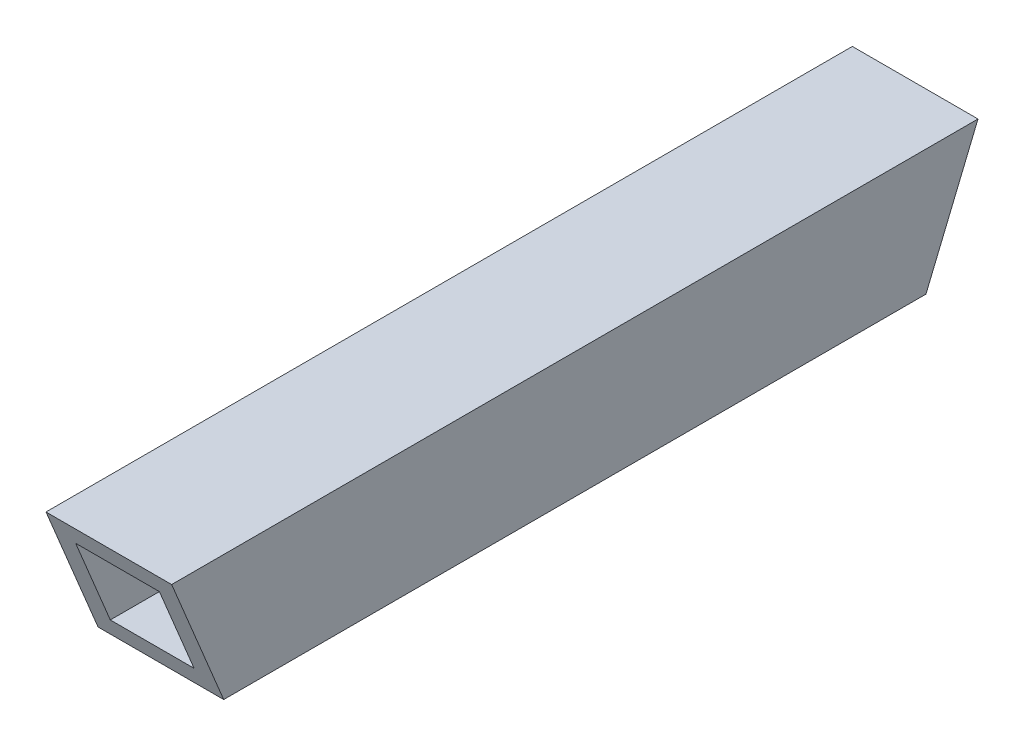
ISO-10303-21;
HEADER;
FILE_DESCRIPTION(('STEP AP214'),'2;1');
FILE_NAME('part.step','',(''),(''),'','','');
FILE_SCHEMA(('AUTOMOTIVE_DESIGN { 1 0 10303 214 1 1 1 1 }'));
ENDSEC;
DATA;
#1=APPLICATION_CONTEXT('core data for automotive mechanical design processes');
#2=APPLICATION_PROTOCOL_DEFINITION('international standard','automotive_design',2000,#1);
#3=PRODUCT_CONTEXT('',#1,'mechanical');
#4=PRODUCT('Part','Part','',(#3));
#5=PRODUCT_RELATED_PRODUCT_CATEGORY('part','',(#4));
#6=PRODUCT_DEFINITION_FORMATION('','',#4);
#7=PRODUCT_DEFINITION_CONTEXT('part definition',#1,'design');
#8=PRODUCT_DEFINITION('design','',#6,#7);
#9=PRODUCT_DEFINITION_SHAPE('','',#8);
#10=(LENGTH_UNIT() NAMED_UNIT(*) SI_UNIT(.MILLI.,.METRE.));
#11=(NAMED_UNIT(*) PLANE_ANGLE_UNIT() SI_UNIT($,.RADIAN.));
#12=(NAMED_UNIT(*) SI_UNIT($,.STERADIAN.) SOLID_ANGLE_UNIT());
#13=UNCERTAINTY_MEASURE_WITH_UNIT(LENGTH_MEASURE(1.E-05),#10,'distance_accuracy_value','');
#14=(GEOMETRIC_REPRESENTATION_CONTEXT(3) GLOBAL_UNCERTAINTY_ASSIGNED_CONTEXT((#13)) GLOBAL_UNIT_ASSIGNED_CONTEXT((#10,
#11,#12)) REPRESENTATION_CONTEXT('',''));
#15=CARTESIAN_POINT('',(0.,0.,0.));
#16=DIRECTION('',(0.,0.,1.));
#17=DIRECTION('',(1.,0.,0.));
#18=AXIS2_PLACEMENT_3D('',#15,#16,#17);
#19=CARTESIAN_POINT('',(9.525,-9.525,61.11875));
#20=DIRECTION('',(-1.,0.,0.));
#21=DIRECTION('',(0.,0.,1.));
#22=AXIS2_PLACEMENT_3D('',#19,#20,#21);
#23=PLANE('',#22);
#24=DIRECTION('',(0.,0.,-1.));
#25=VECTOR('',#24,1.);
#26=CARTESIAN_POINT('',(9.525,-9.525,61.11875));
#27=LINE('',#26,#25);
#28=CARTESIAN_POINT('',(9.525,-9.525,53.2279816367927));
#29=VERTEX_POINT('',#28);
#30=CARTESIAN_POINT('',(9.525,-9.525,-53.2279816367927));
#31=VERTEX_POINT('',#30);
#32=EDGE_CURVE('E125',#29,#31,#27,.T.);
#33=ORIENTED_EDGE('',*,*,#32,.T.);
#34=DIRECTION('',(0.,-0.923879532511289,0.382683432365084));
#35=VECTOR('',#34,1.);
#36=CARTESIAN_POINT('',(9.525,9.525,-61.11875));
#37=LINE('',#36,#35);
#38=CARTESIAN_POINT('',(9.525,9.525,-61.11875));
#39=VERTEX_POINT('',#38);
#40=EDGE_CURVE('E51',#39,#31,#37,.T.);
#41=ORIENTED_EDGE('',*,*,#40,.F.);
#42=DIRECTION('',(0.,0.,-1.));
#43=VECTOR('',#42,1.);
#44=CARTESIAN_POINT('',(9.525,9.525,61.11875));
#45=LINE('',#44,#43);
#46=CARTESIAN_POINT('',(9.525,9.525,61.11875));
#47=VERTEX_POINT('',#46);
#48=EDGE_CURVE('E115',#47,#39,#45,.T.);
#49=ORIENTED_EDGE('',*,*,#48,.F.);
#50=DIRECTION('',(0.,0.923879532511289,0.382683432365084));
#51=VECTOR('',#50,1.);
#52=CARTESIAN_POINT('',(9.525,9.525,61.11875));
#53=LINE('',#52,#51);
#54=EDGE_CURVE('E164',#29,#47,#53,.T.);
#55=ORIENTED_EDGE('',*,*,#54,.F.);
#56=EDGE_LOOP('',(#33,#41,#49,#55));
#57=FACE_BOUND('',#56,.T.);
#58=ADVANCED_FACE('F37',(#57),#23,.F.);
#59=CARTESIAN_POINT('',(-9.525,9.525,61.11875));
#60=DIRECTION('',(0.,-1.,0.));
#61=DIRECTION('',(0.,0.,-1.));
#62=AXIS2_PLACEMENT_3D('',#59,#60,#61);
#63=PLANE('',#62);
#64=DIRECTION('',(-1.,0.,0.));
#65=VECTOR('',#64,1.);
#66=CARTESIAN_POINT('',(-9.525,9.525,-61.11875));
#67=LINE('',#66,#65);
#68=CARTESIAN_POINT('',(-9.52500000000001,9.525,-61.11875));
#69=VERTEX_POINT('',#68);
#70=EDGE_CURVE('E101',#39,#69,#67,.T.);
#71=ORIENTED_EDGE('',*,*,#70,.T.);
#72=DIRECTION('',(0.,0.,-1.));
#73=VECTOR('',#72,1.);
#74=CARTESIAN_POINT('',(-9.525,9.525,61.11875));
#75=LINE('',#74,#73);
#76=CARTESIAN_POINT('',(-9.52500000000001,9.525,61.11875));
#77=VERTEX_POINT('',#76);
#78=EDGE_CURVE('E113',#77,#69,#75,.T.);
#79=ORIENTED_EDGE('',*,*,#78,.F.);
#80=DIRECTION('',(-1.,0.,0.));
#81=VECTOR('',#80,1.);
#82=CARTESIAN_POINT('',(-9.525,9.525,61.11875));
#83=LINE('',#82,#81);
#84=EDGE_CURVE('E116',#47,#77,#83,.T.);
#85=ORIENTED_EDGE('',*,*,#84,.F.);
#86=ORIENTED_EDGE('',*,*,#48,.T.);
#87=EDGE_LOOP('',(#71,#79,#85,#86));
#88=FACE_BOUND('',#87,.T.);
#89=ADVANCED_FACE('F111',(#88),#63,.F.);
#90=CARTESIAN_POINT('',(-9.525,-9.525,61.11875));
#91=DIRECTION('',(1.,0.,0.));
#92=DIRECTION('',(0.,1.,0.));
#93=AXIS2_PLACEMENT_3D('',#90,#91,#92);
#94=PLANE('',#93);
#95=ORIENTED_EDGE('',*,*,#78,.T.);
#96=DIRECTION('',(0.,-0.923879532511289,0.382683432365084));
#97=VECTOR('',#96,1.);
#98=CARTESIAN_POINT('',(-9.52500000000001,9.525,-61.11875));
#99=LINE('',#98,#97);
#100=CARTESIAN_POINT('',(-9.52500000000001,-9.525,-53.2279816367927));
#101=VERTEX_POINT('',#100);
#102=EDGE_CURVE('E98',#69,#101,#99,.T.);
#103=ORIENTED_EDGE('',*,*,#102,.T.);
#104=DIRECTION('',(0.,0.,-1.));
#105=VECTOR('',#104,1.);
#106=CARTESIAN_POINT('',(-9.525,-9.525,61.11875));
#107=LINE('',#106,#105);
#108=CARTESIAN_POINT('',(-9.525,-9.525,53.2279816367927));
#109=VERTEX_POINT('',#108);
#110=EDGE_CURVE('E122',#109,#101,#107,.T.);
#111=ORIENTED_EDGE('',*,*,#110,.F.);
#112=DIRECTION('',(0.,0.923879532511289,0.382683432365084));
#113=VECTOR('',#112,1.);
#114=CARTESIAN_POINT('',(-9.52500000000001,9.525,61.11875));
#115=LINE('',#114,#113);
#116=EDGE_CURVE('E121',#109,#77,#115,.T.);
#117=ORIENTED_EDGE('',*,*,#116,.T.);
#118=EDGE_LOOP('',(#95,#103,#111,#117));
#119=FACE_BOUND('',#118,.T.);
#120=ADVANCED_FACE('F120',(#119),#94,.F.);
#121=CARTESIAN_POINT('',(-9.525,-9.525,61.11875));
#122=DIRECTION('',(0.,1.,0.));
#123=DIRECTION('',(0.,0.,1.));
#124=AXIS2_PLACEMENT_3D('',#121,#122,#123);
#125=PLANE('',#124);
#126=ORIENTED_EDGE('',*,*,#110,.T.);
#127=DIRECTION('',(1.,0.,0.));
#128=VECTOR('',#127,1.);
#129=CARTESIAN_POINT('',(-9.52500000000001,-9.525,-53.2279816367927));
#130=LINE('',#129,#128);
#131=EDGE_CURVE('E102',#101,#31,#130,.T.);
#132=ORIENTED_EDGE('',*,*,#131,.T.);
#133=ORIENTED_EDGE('',*,*,#32,.F.);
#134=DIRECTION('',(1.,0.,0.));
#135=VECTOR('',#134,1.);
#136=CARTESIAN_POINT('',(-9.52500000000001,-9.525,53.2279816367927));
#137=LINE('',#136,#135);
#138=EDGE_CURVE('E149',#109,#29,#137,.T.);
#139=ORIENTED_EDGE('',*,*,#138,.F.);
#140=EDGE_LOOP('',(#126,#132,#133,#139));
#141=FACE_BOUND('',#140,.T.);
#142=ADVANCED_FACE('F167',(#141),#125,.F.);
#143=CARTESIAN_POINT('',(6.34999999999999,-6.34999999999999,61.11875));
#144=DIRECTION('',(-1.,0.,0.));
#145=DIRECTION('',(0.,0.,1.));
#146=AXIS2_PLACEMENT_3D('',#143,#144,#145);
#147=PLANE('',#146);
#148=DIRECTION('',(0.,0.923879532511289,-0.382683432365084));
#149=VECTOR('',#148,1.);
#150=CARTESIAN_POINT('',(6.34999999999999,-47.242642658313,-37.6048225069777));
#151=LINE('',#150,#149);
#152=CARTESIAN_POINT('',(6.34999999999999,-6.34999999999999,-54.5431096973272));
#153=VERTEX_POINT('',#152);
#154=CARTESIAN_POINT('',(6.34999999999999,6.35,-59.8036219394654));
#155=VERTEX_POINT('',#154);
#156=EDGE_CURVE('E174',#153,#155,#151,.T.);
#157=ORIENTED_EDGE('',*,*,#156,.F.);
#158=DIRECTION('',(0.,0.,-1.));
#159=VECTOR('',#158,1.);
#160=CARTESIAN_POINT('',(6.34999999999999,-6.34999999999999,61.11875));
#161=LINE('',#160,#159);
#162=CARTESIAN_POINT('',(6.34999999999999,-6.34999999999999,54.5431096973272));
#163=VERTEX_POINT('',#162);
#164=EDGE_CURVE('E152',#163,#153,#161,.T.);
#165=ORIENTED_EDGE('',*,*,#164,.F.);
#166=DIRECTION('',(0.,-0.923879532511289,-0.382683432365084));
#167=VECTOR('',#166,1.);
#168=CARTESIAN_POINT('',(6.34999999999999,-4.02516007566829,55.5060899243319));
#169=LINE('',#168,#167);
#170=CARTESIAN_POINT('',(6.34999999999999,6.35,59.8036219394654));
#171=VERTEX_POINT('',#170);
#172=EDGE_CURVE('E136',#171,#163,#169,.T.);
#173=ORIENTED_EDGE('',*,*,#172,.F.);
#174=DIRECTION('',(0.,0.,-1.));
#175=VECTOR('',#174,1.);
#176=CARTESIAN_POINT('',(6.34999999999999,6.35,61.11875));
#177=LINE('',#176,#175);
#178=EDGE_CURVE('E117',#171,#155,#177,.T.);
#179=ORIENTED_EDGE('',*,*,#178,.T.);
#180=EDGE_LOOP('',(#157,#165,#173,#179));
#181=FACE_BOUND('',#180,.T.);
#182=ADVANCED_FACE('F183',(#181),#147,.T.);
#183=CARTESIAN_POINT('',(-6.35,6.35,61.11875));
#184=DIRECTION('',(0.,-1.,0.));
#185=DIRECTION('',(0.,0.,-1.));
#186=AXIS2_PLACEMENT_3D('',#183,#184,#185);
#187=PLANE('',#186);
#188=DIRECTION('',(-1.,0.,0.));
#189=VECTOR('',#188,1.);
#190=CARTESIAN_POINT('',(-6.35,6.35,-59.8036219394654));
#191=LINE('',#190,#189);
#192=CARTESIAN_POINT('',(-6.35,6.35,-59.8036219394655));
#193=VERTEX_POINT('',#192);
#194=EDGE_CURVE('E169',#155,#193,#191,.T.);
#195=ORIENTED_EDGE('',*,*,#194,.F.);
#196=ORIENTED_EDGE('',*,*,#178,.F.);
#197=DIRECTION('',(1.,0.,0.));
#198=VECTOR('',#197,1.);
#199=CARTESIAN_POINT('',(-6.35,6.35,59.8036219394654));
#200=LINE('',#199,#198);
#201=CARTESIAN_POINT('',(-6.35,6.35,59.8036219394655));
#202=VERTEX_POINT('',#201);
#203=EDGE_CURVE('E148',#202,#171,#200,.T.);
#204=ORIENTED_EDGE('',*,*,#203,.F.);
#205=DIRECTION('',(0.,0.,-1.));
#206=VECTOR('',#205,1.);
#207=CARTESIAN_POINT('',(-6.35,6.35,61.11875));
#208=LINE('',#207,#206);
#209=EDGE_CURVE('E147',#202,#193,#208,.T.);
#210=ORIENTED_EDGE('',*,*,#209,.T.);
#211=EDGE_LOOP('',(#195,#196,#204,#210));
#212=FACE_BOUND('',#211,.T.);
#213=ADVANCED_FACE('F185',(#212),#187,.T.);
#214=CARTESIAN_POINT('',(-6.35,-6.34999999999999,61.11875));
#215=DIRECTION('',(1.,0.,0.));
#216=DIRECTION('',(0.,0.,-1.));
#217=AXIS2_PLACEMENT_3D('',#214,#215,#216);
#218=PLANE('',#217);
#219=DIRECTION('',(0.,-0.923879532511289,0.382683432365084));
#220=VECTOR('',#219,1.);
#221=CARTESIAN_POINT('',(-6.35,-47.242642658313,-37.6048225069777));
#222=LINE('',#221,#220);
#223=CARTESIAN_POINT('',(-6.35,-6.34999999999999,-54.5431096973272));
#224=VERTEX_POINT('',#223);
#225=EDGE_CURVE('E58',#193,#224,#222,.T.);
#226=ORIENTED_EDGE('',*,*,#225,.F.);
#227=ORIENTED_EDGE('',*,*,#209,.F.);
#228=DIRECTION('',(0.,0.923879532511289,0.382683432365084));
#229=VECTOR('',#228,1.);
#230=CARTESIAN_POINT('',(-6.35,-4.02516007566829,55.5060899243319));
#231=LINE('',#230,#229);
#232=CARTESIAN_POINT('',(-6.35,-6.34999999999999,54.5431096973272));
#233=VERTEX_POINT('',#232);
#234=EDGE_CURVE('E133',#233,#202,#231,.T.);
#235=ORIENTED_EDGE('',*,*,#234,.F.);
#236=DIRECTION('',(0.,0.,-1.));
#237=VECTOR('',#236,1.);
#238=CARTESIAN_POINT('',(-6.35,-6.34999999999999,61.11875));
#239=LINE('',#238,#237);
#240=EDGE_CURVE('E145',#233,#224,#239,.T.);
#241=ORIENTED_EDGE('',*,*,#240,.T.);
#242=EDGE_LOOP('',(#226,#227,#235,#241));
#243=FACE_BOUND('',#242,.T.);
#244=ADVANCED_FACE('F144',(#243),#218,.T.);
#245=CARTESIAN_POINT('',(-6.35,-6.34999999999999,61.11875));
#246=DIRECTION('',(0.,1.,0.));
#247=DIRECTION('',(0.,0.,1.));
#248=AXIS2_PLACEMENT_3D('',#245,#246,#247);
#249=PLANE('',#248);
#250=DIRECTION('',(1.,0.,0.));
#251=VECTOR('',#250,1.);
#252=CARTESIAN_POINT('',(-6.35,-6.34999999999999,-54.5431096973272));
#253=LINE('',#252,#251);
#254=EDGE_CURVE('E11',#224,#153,#253,.T.);
#255=ORIENTED_EDGE('',*,*,#254,.F.);
#256=ORIENTED_EDGE('',*,*,#240,.F.);
#257=DIRECTION('',(-1.,0.,0.));
#258=VECTOR('',#257,1.);
#259=CARTESIAN_POINT('',(-6.35,-6.34999999999999,54.5431096973272));
#260=LINE('',#259,#258);
#261=EDGE_CURVE('E44',#163,#233,#260,.T.);
#262=ORIENTED_EDGE('',*,*,#261,.F.);
#263=ORIENTED_EDGE('',*,*,#164,.T.);
#264=EDGE_LOOP('',(#255,#256,#262,#263));
#265=FACE_BOUND('',#264,.T.);
#266=ADVANCED_FACE('F151',(#265),#249,.T.);
#267=CARTESIAN_POINT('',(-9.52500000000001,9.525,61.11875));
#268=DIRECTION('',(0.,0.382683432365084,-0.923879532511289));
#269=DIRECTION('',(0.,0.923879532511289,0.382683432365084));
#270=AXIS2_PLACEMENT_3D('',#267,#268,#269);
#271=PLANE('',#270);
#272=ORIENTED_EDGE('',*,*,#172,.T.);
#273=ORIENTED_EDGE('',*,*,#261,.T.);
#274=ORIENTED_EDGE('',*,*,#234,.T.);
#275=ORIENTED_EDGE('',*,*,#203,.T.);
#276=EDGE_LOOP('',(#272,#273,#274,#275));
#277=FACE_BOUND('',#276,.T.);
#278=ORIENTED_EDGE('',*,*,#54,.T.);
#279=ORIENTED_EDGE('',*,*,#84,.T.);
#280=ORIENTED_EDGE('',*,*,#116,.F.);
#281=ORIENTED_EDGE('',*,*,#138,.T.);
#282=EDGE_LOOP('',(#278,#279,#280,#281));
#283=FACE_BOUND('',#282,.T.);
#284=ADVANCED_FACE('F131',(#277,#283),#271,.F.);
#285=CARTESIAN_POINT('',(-9.52500000000001,9.525,-61.11875));
#286=DIRECTION('',(0.,0.382683432365084,0.923879532511289));
#287=DIRECTION('',(0.,-0.923879532511289,0.382683432365084));
#288=AXIS2_PLACEMENT_3D('',#285,#286,#287);
#289=PLANE('',#288);
#290=ORIENTED_EDGE('',*,*,#156,.T.);
#291=ORIENTED_EDGE('',*,*,#194,.T.);
#292=ORIENTED_EDGE('',*,*,#225,.T.);
#293=ORIENTED_EDGE('',*,*,#254,.T.);
#294=EDGE_LOOP('',(#290,#291,#292,#293));
#295=FACE_BOUND('',#294,.T.);
#296=ORIENTED_EDGE('',*,*,#40,.T.);
#297=ORIENTED_EDGE('',*,*,#131,.F.);
#298=ORIENTED_EDGE('',*,*,#102,.F.);
#299=ORIENTED_EDGE('',*,*,#70,.F.);
#300=EDGE_LOOP('',(#296,#297,#298,#299));
#301=FACE_BOUND('',#300,.T.);
#302=ADVANCED_FACE('F100',(#295,#301),#289,.F.);
#303=CLOSED_SHELL('',(#58,#89,#120,#142,#182,#213,#244,#266,#284,#302));
#304=MANIFOLD_SOLID_BREP('B2',#303);
#305=ADVANCED_BREP_SHAPE_REPRESENTATION('',(#18,#304),#14);
#306=SHAPE_DEFINITION_REPRESENTATION(#9,#305);
ENDSEC;
END-ISO-10303-21;
